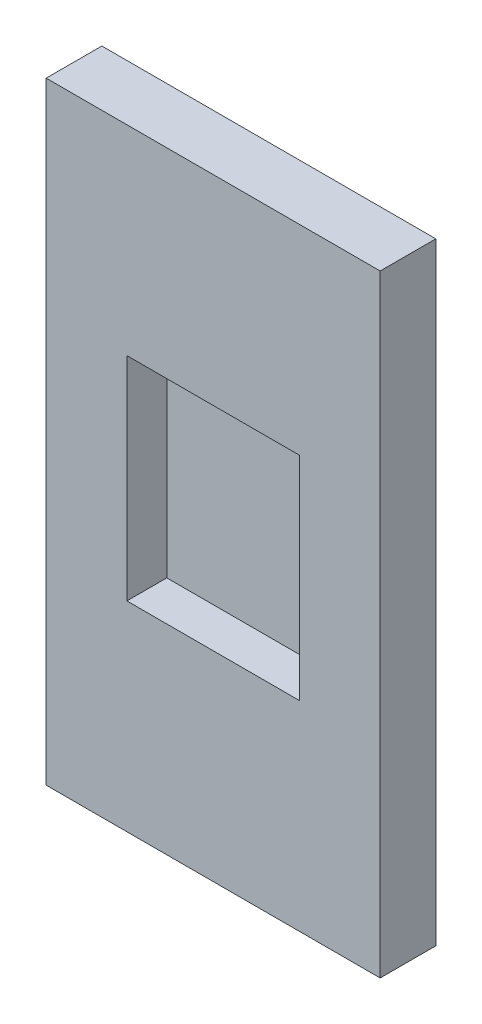
ISO-10303-21;
HEADER;
FILE_DESCRIPTION(('STEP AP214'),'2;1');
FILE_NAME('part.step','',(''),(''),'','','');
FILE_SCHEMA(('AUTOMOTIVE_DESIGN { 1 0 10303 214 1 1 1 1 }'));
ENDSEC;
DATA;
#1=APPLICATION_CONTEXT('core data for automotive mechanical design processes');
#2=APPLICATION_PROTOCOL_DEFINITION('international standard','automotive_design',2000,#1);
#3=PRODUCT_CONTEXT('',#1,'mechanical');
#4=PRODUCT('Part','Part','',(#3));
#5=PRODUCT_RELATED_PRODUCT_CATEGORY('part','',(#4));
#6=PRODUCT_DEFINITION_FORMATION('','',#4);
#7=PRODUCT_DEFINITION_CONTEXT('part definition',#1,'design');
#8=PRODUCT_DEFINITION('design','',#6,#7);
#9=PRODUCT_DEFINITION_SHAPE('','',#8);
#10=(LENGTH_UNIT() NAMED_UNIT(*) SI_UNIT(.MILLI.,.METRE.));
#11=(NAMED_UNIT(*) PLANE_ANGLE_UNIT() SI_UNIT($,.RADIAN.));
#12=(NAMED_UNIT(*) SI_UNIT($,.STERADIAN.) SOLID_ANGLE_UNIT());
#13=UNCERTAINTY_MEASURE_WITH_UNIT(LENGTH_MEASURE(1.E-05),#10,'distance_accuracy_value','');
#14=(GEOMETRIC_REPRESENTATION_CONTEXT(3) GLOBAL_UNCERTAINTY_ASSIGNED_CONTEXT((#13)) GLOBAL_UNIT_ASSIGNED_CONTEXT((#10,
#11,#12)) REPRESENTATION_CONTEXT('',''));
#15=CARTESIAN_POINT('',(0.,0.,0.));
#16=DIRECTION('',(0.,0.,1.));
#17=DIRECTION('',(1.,0.,0.));
#18=AXIS2_PLACEMENT_3D('',#15,#16,#17);
#19=CARTESIAN_POINT('',(9.,-16.5,3.));
#20=DIRECTION('',(-1.,0.,0.));
#21=DIRECTION('',(0.,0.,1.));
#22=AXIS2_PLACEMENT_3D('',#19,#20,#21);
#23=PLANE('',#22);
#24=DIRECTION('',(0.,1.,0.));
#25=VECTOR('',#24,1.);
#26=CARTESIAN_POINT('',(9.,-16.5,0.));
#27=LINE('',#26,#25);
#28=CARTESIAN_POINT('',(9.,-16.5,0.));
#29=VERTEX_POINT('',#28);
#30=CARTESIAN_POINT('',(9.,16.5,0.));
#31=VERTEX_POINT('',#30);
#32=EDGE_CURVE('E158',#29,#31,#27,.T.);
#33=ORIENTED_EDGE('',*,*,#32,.T.);
#34=DIRECTION('',(0.,0.,-1.));
#35=VECTOR('',#34,1.);
#36=CARTESIAN_POINT('',(9.,16.5,3.));
#37=LINE('',#36,#35);
#38=CARTESIAN_POINT('',(9.,16.5,3.));
#39=VERTEX_POINT('',#38);
#40=EDGE_CURVE('E11',#39,#31,#37,.T.);
#41=ORIENTED_EDGE('',*,*,#40,.F.);
#42=DIRECTION('',(0.,1.,0.));
#43=VECTOR('',#42,1.);
#44=CARTESIAN_POINT('',(9.,-16.5,3.));
#45=LINE('',#44,#43);
#46=CARTESIAN_POINT('',(9.,-16.5,3.));
#47=VERTEX_POINT('',#46);
#48=EDGE_CURVE('E164',#47,#39,#45,.T.);
#49=ORIENTED_EDGE('',*,*,#48,.F.);
#50=DIRECTION('',(0.,0.,-1.));
#51=VECTOR('',#50,1.);
#52=CARTESIAN_POINT('',(9.,-16.5,3.));
#53=LINE('',#52,#51);
#54=EDGE_CURVE('E174',#47,#29,#53,.T.);
#55=ORIENTED_EDGE('',*,*,#54,.T.);
#56=EDGE_LOOP('',(#33,#41,#49,#55));
#57=FACE_BOUND('',#56,.T.);
#58=ADVANCED_FACE('F39',(#57),#23,.F.);
#59=CARTESIAN_POINT('',(-9.,16.5,3.));
#60=DIRECTION('',(0.,-1.,0.));
#61=DIRECTION('',(0.,0.,-1.));
#62=AXIS2_PLACEMENT_3D('',#59,#60,#61);
#63=PLANE('',#62);
#64=DIRECTION('',(-1.,0.,0.));
#65=VECTOR('',#64,1.);
#66=CARTESIAN_POINT('',(-9.,16.5,0.));
#67=LINE('',#66,#65);
#68=CARTESIAN_POINT('',(-9.,16.5,0.));
#69=VERTEX_POINT('',#68);
#70=EDGE_CURVE('E178',#31,#69,#67,.T.);
#71=ORIENTED_EDGE('',*,*,#70,.T.);
#72=DIRECTION('',(0.,0.,-1.));
#73=VECTOR('',#72,1.);
#74=CARTESIAN_POINT('',(-9.,16.5,3.));
#75=LINE('',#74,#73);
#76=CARTESIAN_POINT('',(-9.,16.5,3.));
#77=VERTEX_POINT('',#76);
#78=EDGE_CURVE('E47',#77,#69,#75,.T.);
#79=ORIENTED_EDGE('',*,*,#78,.F.);
#80=DIRECTION('',(-1.,0.,0.));
#81=VECTOR('',#80,1.);
#82=CARTESIAN_POINT('',(-9.,16.5,3.));
#83=LINE('',#82,#81);
#84=EDGE_CURVE('E91',#39,#77,#83,.T.);
#85=ORIENTED_EDGE('',*,*,#84,.F.);
#86=ORIENTED_EDGE('',*,*,#40,.T.);
#87=EDGE_LOOP('',(#71,#79,#85,#86));
#88=FACE_BOUND('',#87,.T.);
#89=ADVANCED_FACE('F213',(#88),#63,.F.);
#90=CARTESIAN_POINT('',(-9.,-16.5,3.));
#91=DIRECTION('',(1.,0.,0.));
#92=DIRECTION('',(0.,0.,-1.));
#93=AXIS2_PLACEMENT_3D('',#90,#91,#92);
#94=PLANE('',#93);
#95=DIRECTION('',(0.,-1.,0.));
#96=VECTOR('',#95,1.);
#97=CARTESIAN_POINT('',(-9.,-16.5,0.));
#98=LINE('',#97,#96);
#99=CARTESIAN_POINT('',(-9.,-16.5,0.));
#100=VERTEX_POINT('',#99);
#101=EDGE_CURVE('E181',#69,#100,#98,.T.);
#102=ORIENTED_EDGE('',*,*,#101,.T.);
#103=DIRECTION('',(0.,0.,-1.));
#104=VECTOR('',#103,1.);
#105=CARTESIAN_POINT('',(-9.,-16.5,3.));
#106=LINE('',#105,#104);
#107=CARTESIAN_POINT('',(-9.,-16.5,3.));
#108=VERTEX_POINT('',#107);
#109=EDGE_CURVE('E188',#108,#100,#106,.T.);
#110=ORIENTED_EDGE('',*,*,#109,.F.);
#111=DIRECTION('',(0.,-1.,0.));
#112=VECTOR('',#111,1.);
#113=CARTESIAN_POINT('',(-9.,-16.5,3.));
#114=LINE('',#113,#112);
#115=EDGE_CURVE('E169',#77,#108,#114,.T.);
#116=ORIENTED_EDGE('',*,*,#115,.F.);
#117=ORIENTED_EDGE('',*,*,#78,.T.);
#118=EDGE_LOOP('',(#102,#110,#116,#117));
#119=FACE_BOUND('',#118,.T.);
#120=ADVANCED_FACE('F195',(#119),#94,.F.);
#121=CARTESIAN_POINT('',(-9.,-16.5,3.));
#122=DIRECTION('',(0.,1.,0.));
#123=DIRECTION('',(0.,0.,1.));
#124=AXIS2_PLACEMENT_3D('',#121,#122,#123);
#125=PLANE('',#124);
#126=DIRECTION('',(1.,0.,0.));
#127=VECTOR('',#126,1.);
#128=CARTESIAN_POINT('',(-9.,-16.5,0.));
#129=LINE('',#128,#127);
#130=EDGE_CURVE('E84',#100,#29,#129,.T.);
#131=ORIENTED_EDGE('',*,*,#130,.T.);
#132=ORIENTED_EDGE('',*,*,#54,.F.);
#133=DIRECTION('',(1.,0.,0.));
#134=VECTOR('',#133,1.);
#135=CARTESIAN_POINT('',(-9.,-16.5,3.));
#136=LINE('',#135,#134);
#137=EDGE_CURVE('E63',#108,#47,#136,.T.);
#138=ORIENTED_EDGE('',*,*,#137,.F.);
#139=ORIENTED_EDGE('',*,*,#109,.T.);
#140=EDGE_LOOP('',(#131,#132,#138,#139));
#141=FACE_BOUND('',#140,.T.);
#142=ADVANCED_FACE('F203',(#141),#125,.F.);
#143=CARTESIAN_POINT('',(0.,0.,3.));
#144=DIRECTION('',(0.,0.,-1.));
#145=DIRECTION('',(-1.,0.,0.));
#146=AXIS2_PLACEMENT_3D('',#143,#144,#145);
#147=PLANE('',#146);
#148=DIRECTION('',(-1.,0.,0.));
#149=VECTOR('',#148,1.);
#150=CARTESIAN_POINT('',(-4.65,5.725,3.));
#151=LINE('',#150,#149);
#152=CARTESIAN_POINT('',(4.65,5.725,3.));
#153=VERTEX_POINT('',#152);
#154=CARTESIAN_POINT('',(-4.65,5.725,3.));
#155=VERTEX_POINT('',#154);
#156=EDGE_CURVE('E149',#153,#155,#151,.T.);
#157=ORIENTED_EDGE('',*,*,#156,.F.);
#158=DIRECTION('',(0.,1.,0.));
#159=VECTOR('',#158,1.);
#160=CARTESIAN_POINT('',(4.65,-5.725,3.));
#161=LINE('',#160,#159);
#162=CARTESIAN_POINT('',(4.65,-5.725,3.));
#163=VERTEX_POINT('',#162);
#164=EDGE_CURVE('E54',#163,#153,#161,.T.);
#165=ORIENTED_EDGE('',*,*,#164,.F.);
#166=DIRECTION('',(1.,0.,0.));
#167=VECTOR('',#166,1.);
#168=CARTESIAN_POINT('',(-4.65,-5.725,3.));
#169=LINE('',#168,#167);
#170=CARTESIAN_POINT('',(-4.65,-5.725,3.));
#171=VERTEX_POINT('',#170);
#172=EDGE_CURVE('E136',#171,#163,#169,.T.);
#173=ORIENTED_EDGE('',*,*,#172,.F.);
#174=DIRECTION('',(0.,-1.,0.));
#175=VECTOR('',#174,1.);
#176=CARTESIAN_POINT('',(-4.65,-5.725,3.));
#177=LINE('',#176,#175);
#178=EDGE_CURVE('E140',#155,#171,#177,.T.);
#179=ORIENTED_EDGE('',*,*,#178,.F.);
#180=EDGE_LOOP('',(#157,#165,#173,#179));
#181=FACE_BOUND('',#180,.T.);
#182=ORIENTED_EDGE('',*,*,#48,.T.);
#183=ORIENTED_EDGE('',*,*,#84,.T.);
#184=ORIENTED_EDGE('',*,*,#115,.T.);
#185=ORIENTED_EDGE('',*,*,#137,.T.);
#186=EDGE_LOOP('',(#182,#183,#184,#185));
#187=FACE_BOUND('',#186,.T.);
#188=ADVANCED_FACE('F205',(#181,#187),#147,.F.);
#189=CARTESIAN_POINT('',(0.,0.,0.));
#190=DIRECTION('',(0.,0.,-1.));
#191=DIRECTION('',(-1.,0.,0.));
#192=AXIS2_PLACEMENT_3D('',#189,#190,#191);
#193=PLANE('',#192);
#194=ORIENTED_EDGE('',*,*,#32,.F.);
#195=ORIENTED_EDGE('',*,*,#130,.F.);
#196=ORIENTED_EDGE('',*,*,#101,.F.);
#197=ORIENTED_EDGE('',*,*,#70,.F.);
#198=EDGE_LOOP('',(#194,#195,#196,#197));
#199=FACE_BOUND('',#198,.T.);
#200=ADVANCED_FACE('F199',(#199),#193,.T.);
#201=CARTESIAN_POINT('',(4.65,-5.725,0.85));
#202=DIRECTION('',(1.,0.,0.));
#203=DIRECTION('',(0.,0.,-1.));
#204=AXIS2_PLACEMENT_3D('',#201,#202,#203);
#205=PLANE('',#204);
#206=ORIENTED_EDGE('',*,*,#164,.T.);
#207=DIRECTION('',(0.,0.,1.));
#208=VECTOR('',#207,1.);
#209=CARTESIAN_POINT('',(4.65,5.725,0.85));
#210=LINE('',#209,#208);
#211=CARTESIAN_POINT('',(4.65,5.725,0.85));
#212=VERTEX_POINT('',#211);
#213=EDGE_CURVE('E111',#212,#153,#210,.T.);
#214=ORIENTED_EDGE('',*,*,#213,.F.);
#215=DIRECTION('',(0.,1.,0.));
#216=VECTOR('',#215,1.);
#217=CARTESIAN_POINT('',(4.65,-5.725,0.85));
#218=LINE('',#217,#216);
#219=CARTESIAN_POINT('',(4.65,-5.725,0.85));
#220=VERTEX_POINT('',#219);
#221=EDGE_CURVE('E115',#220,#212,#218,.T.);
#222=ORIENTED_EDGE('',*,*,#221,.F.);
#223=DIRECTION('',(0.,0.,1.));
#224=VECTOR('',#223,1.);
#225=CARTESIAN_POINT('',(4.65,-5.725,0.85));
#226=LINE('',#225,#224);
#227=EDGE_CURVE('E155',#220,#163,#226,.T.);
#228=ORIENTED_EDGE('',*,*,#227,.T.);
#229=EDGE_LOOP('',(#206,#214,#222,#228));
#230=FACE_BOUND('',#229,.T.);
#231=ADVANCED_FACE('F113',(#230),#205,.F.);
#232=CARTESIAN_POINT('',(-4.65,-5.725,0.85));
#233=DIRECTION('',(0.,-1.,0.));
#234=DIRECTION('',(0.,0.,-1.));
#235=AXIS2_PLACEMENT_3D('',#232,#233,#234);
#236=PLANE('',#235);
#237=ORIENTED_EDGE('',*,*,#172,.T.);
#238=ORIENTED_EDGE('',*,*,#227,.F.);
#239=DIRECTION('',(1.,0.,0.));
#240=VECTOR('',#239,1.);
#241=CARTESIAN_POINT('',(-4.65,-5.725,0.85));
#242=LINE('',#241,#240);
#243=CARTESIAN_POINT('',(-4.65,-5.725,0.85));
#244=VERTEX_POINT('',#243);
#245=EDGE_CURVE('E122',#244,#220,#242,.T.);
#246=ORIENTED_EDGE('',*,*,#245,.F.);
#247=DIRECTION('',(0.,0.,1.));
#248=VECTOR('',#247,1.);
#249=CARTESIAN_POINT('',(-4.65,-5.725,0.85));
#250=LINE('',#249,#248);
#251=EDGE_CURVE('E159',#244,#171,#250,.T.);
#252=ORIENTED_EDGE('',*,*,#251,.T.);
#253=EDGE_LOOP('',(#237,#238,#246,#252));
#254=FACE_BOUND('',#253,.T.);
#255=ADVANCED_FACE('F252',(#254),#236,.F.);
#256=CARTESIAN_POINT('',(-4.65,-5.725,0.85));
#257=DIRECTION('',(-1.,0.,0.));
#258=DIRECTION('',(0.,0.,1.));
#259=AXIS2_PLACEMENT_3D('',#256,#257,#258);
#260=PLANE('',#259);
#261=ORIENTED_EDGE('',*,*,#178,.T.);
#262=ORIENTED_EDGE('',*,*,#251,.F.);
#263=DIRECTION('',(0.,-1.,0.));
#264=VECTOR('',#263,1.);
#265=CARTESIAN_POINT('',(-4.65,-5.725,0.85));
#266=LINE('',#265,#264);
#267=CARTESIAN_POINT('',(-4.65,5.725,0.85));
#268=VERTEX_POINT('',#267);
#269=EDGE_CURVE('E131',#268,#244,#266,.T.);
#270=ORIENTED_EDGE('',*,*,#269,.F.);
#271=DIRECTION('',(0.,0.,1.));
#272=VECTOR('',#271,1.);
#273=CARTESIAN_POINT('',(-4.65,5.725,0.85));
#274=LINE('',#273,#272);
#275=EDGE_CURVE('E121',#268,#155,#274,.T.);
#276=ORIENTED_EDGE('',*,*,#275,.T.);
#277=EDGE_LOOP('',(#261,#262,#270,#276));
#278=FACE_BOUND('',#277,.T.);
#279=ADVANCED_FACE('F261',(#278),#260,.F.);
#280=CARTESIAN_POINT('',(-4.65,5.725,0.85));
#281=DIRECTION('',(0.,1.,0.));
#282=DIRECTION('',(0.,0.,1.));
#283=AXIS2_PLACEMENT_3D('',#280,#281,#282);
#284=PLANE('',#283);
#285=ORIENTED_EDGE('',*,*,#156,.T.);
#286=ORIENTED_EDGE('',*,*,#275,.F.);
#287=DIRECTION('',(-1.,0.,0.));
#288=VECTOR('',#287,1.);
#289=CARTESIAN_POINT('',(-4.65,5.725,0.85));
#290=LINE('',#289,#288);
#291=EDGE_CURVE('E125',#212,#268,#290,.T.);
#292=ORIENTED_EDGE('',*,*,#291,.F.);
#293=ORIENTED_EDGE('',*,*,#213,.T.);
#294=EDGE_LOOP('',(#285,#286,#292,#293));
#295=FACE_BOUND('',#294,.T.);
#296=ADVANCED_FACE('F126',(#295),#284,.F.);
#297=CARTESIAN_POINT('',(0.,0.,0.85));
#298=DIRECTION('',(0.,0.,-1.));
#299=DIRECTION('',(-1.,0.,0.));
#300=AXIS2_PLACEMENT_3D('',#297,#298,#299);
#301=PLANE('',#300);
#302=ORIENTED_EDGE('',*,*,#221,.T.);
#303=ORIENTED_EDGE('',*,*,#291,.T.);
#304=ORIENTED_EDGE('',*,*,#269,.T.);
#305=ORIENTED_EDGE('',*,*,#245,.T.);
#306=EDGE_LOOP('',(#302,#303,#304,#305));
#307=FACE_BOUND('',#306,.T.);
#308=ADVANCED_FACE('F133',(#307),#301,.F.);
#309=CLOSED_SHELL('',(#58,#89,#120,#142,#188,#200,#231,#255,#279,#296,#308));
#310=MANIFOLD_SOLID_BREP('B2',#309);
#311=ADVANCED_BREP_SHAPE_REPRESENTATION('',(#18,#310),#14);
#312=SHAPE_DEFINITION_REPRESENTATION(#9,#311);
ENDSEC;
END-ISO-10303-21;
